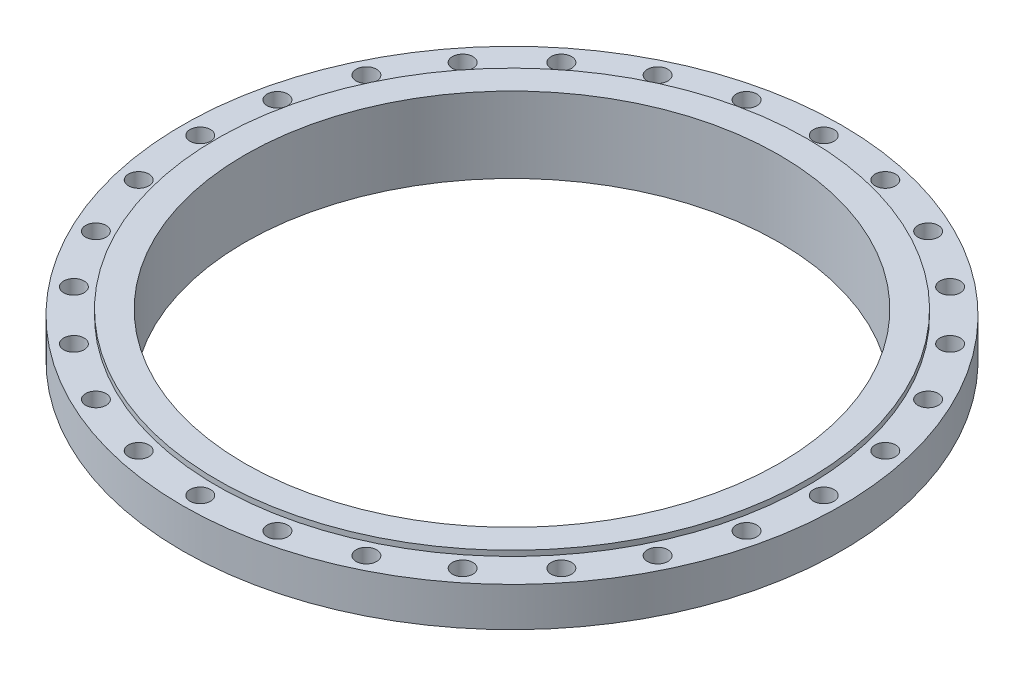
ISO-10303-21;
HEADER;
FILE_DESCRIPTION(('STEP AP214'),'2;1');
FILE_NAME('part.step','',(''),(''),'','','');
FILE_SCHEMA(('AUTOMOTIVE_DESIGN { 1 0 10303 214 1 1 1 1 }'));
ENDSEC;
DATA;
#1=APPLICATION_CONTEXT('core data for automotive mechanical design processes');
#2=APPLICATION_PROTOCOL_DEFINITION('international standard','automotive_design',2000,#1);
#3=PRODUCT_CONTEXT('',#1,'mechanical');
#4=PRODUCT('Part','Part','',(#3));
#5=PRODUCT_RELATED_PRODUCT_CATEGORY('part','',(#4));
#6=PRODUCT_DEFINITION_FORMATION('','',#4);
#7=PRODUCT_DEFINITION_CONTEXT('part definition',#1,'design');
#8=PRODUCT_DEFINITION('design','',#6,#7);
#9=PRODUCT_DEFINITION_SHAPE('','',#8);
#10=(LENGTH_UNIT() NAMED_UNIT(*) SI_UNIT(.MILLI.,.METRE.));
#11=(NAMED_UNIT(*) PLANE_ANGLE_UNIT() SI_UNIT($,.RADIAN.));
#12=(NAMED_UNIT(*) SI_UNIT($,.STERADIAN.) SOLID_ANGLE_UNIT());
#13=UNCERTAINTY_MEASURE_WITH_UNIT(LENGTH_MEASURE(1.E-05),#10,'distance_accuracy_value','');
#14=(GEOMETRIC_REPRESENTATION_CONTEXT(3) GLOBAL_UNCERTAINTY_ASSIGNED_CONTEXT((#13)) GLOBAL_UNIT_ASSIGNED_CONTEXT((#10,
#11,#12)) REPRESENTATION_CONTEXT('',''));
#15=CARTESIAN_POINT('',(0.,0.,0.));
#16=DIRECTION('',(0.,0.,1.));
#17=DIRECTION('',(1.,0.,0.));
#18=AXIS2_PLACEMENT_3D('',#15,#16,#17);
#19=CARTESIAN_POINT('',(-312.,0.,0.));
#20=DIRECTION('',(0.,1.,0.));
#21=DIRECTION('',(0.,0.,1.));
#22=AXIS2_PLACEMENT_3D('',#19,#20,#21);
#23=PLANE('',#22);
#24=CARTESIAN_POINT('',(0.,0.,0.));
#25=DIRECTION('',(0.,-1.,0.));
#26=DIRECTION('',(0.,0.,-1.));
#27=AXIS2_PLACEMENT_3D('',#24,#25,#26);
#28=CIRCLE('',#27,300.);
#29=CARTESIAN_POINT('',(0.,0.,-300.));
#30=VERTEX_POINT('',#29);
#31=EDGE_CURVE('E10',#30,#30,#28,.T.);
#32=ORIENTED_EDGE('',*,*,#31,.F.);
#33=EDGE_LOOP('',(#32));
#34=FACE_BOUND('',#33,.T.);
#35=CARTESIAN_POINT('',(0.,0.,0.));
#36=DIRECTION('',(0.,-1.,0.));
#37=DIRECTION('',(0.,0.,-1.));
#38=AXIS2_PLACEMENT_3D('',#35,#36,#37);
#39=CIRCLE('',#38,312.);
#40=CARTESIAN_POINT('',(0.,0.,-312.));
#41=VERTEX_POINT('',#40);
#42=EDGE_CURVE('E53',#41,#41,#39,.T.);
#43=ORIENTED_EDGE('',*,*,#42,.T.);
#44=EDGE_LOOP('',(#43));
#45=FACE_BOUND('',#44,.T.);
#46=ADVANCED_FACE('F34',(#34,#45),#23,.F.);
#47=CARTESIAN_POINT('',(0.,0.,0.));
#48=DIRECTION('',(0.,-1.,0.));
#49=DIRECTION('',(0.,0.,-1.));
#50=AXIS2_PLACEMENT_3D('',#47,#48,#49);
#51=CYLINDRICAL_SURFACE('',#50,300.);
#52=CARTESIAN_POINT('',(0.,85.,0.));
#53=DIRECTION('',(0.,-1.,0.));
#54=DIRECTION('',(0.,0.,-1.));
#55=AXIS2_PLACEMENT_3D('',#52,#53,#54);
#56=CIRCLE('',#55,300.);
#57=CARTESIAN_POINT('',(0.,85.,-300.));
#58=VERTEX_POINT('',#57);
#59=EDGE_CURVE('E41',#58,#58,#56,.T.);
#60=ORIENTED_EDGE('',*,*,#59,.F.);
#61=EDGE_LOOP('',(#60));
#62=FACE_BOUND('',#61,.T.);
#63=ORIENTED_EDGE('',*,*,#31,.T.);
#64=EDGE_LOOP('',(#63));
#65=FACE_BOUND('',#64,.T.);
#66=ADVANCED_FACE('F243',(#62,#65),#51,.F.);
#67=CARTESIAN_POINT('',(-300.,85.,0.));
#68=DIRECTION('',(0.,-1.,0.));
#69=DIRECTION('',(0.,0.,-1.));
#70=AXIS2_PLACEMENT_3D('',#67,#68,#69);
#71=PLANE('',#70);
#72=CARTESIAN_POINT('',(0.,85.,0.));
#73=DIRECTION('',(0.,-1.,0.));
#74=DIRECTION('',(0.,0.,-1.));
#75=AXIS2_PLACEMENT_3D('',#72,#73,#74);
#76=CIRCLE('',#75,331.5);
#77=CARTESIAN_POINT('',(0.,85.,-331.5));
#78=VERTEX_POINT('',#77);
#79=EDGE_CURVE('E46',#78,#78,#76,.T.);
#80=ORIENTED_EDGE('',*,*,#79,.F.);
#81=EDGE_LOOP('',(#80));
#82=FACE_BOUND('',#81,.T.);
#83=ORIENTED_EDGE('',*,*,#59,.T.);
#84=EDGE_LOOP('',(#83));
#85=FACE_BOUND('',#84,.T.);
#86=ADVANCED_FACE('F240',(#82,#85),#71,.F.);
#87=CARTESIAN_POINT('',(0.,0.,0.));
#88=DIRECTION('',(0.,-1.,0.));
#89=DIRECTION('',(0.,0.,-1.));
#90=AXIS2_PLACEMENT_3D('',#87,#88,#89);
#91=CYLINDRICAL_SURFACE('',#90,331.5);
#92=CARTESIAN_POINT('',(0.,79.,0.));
#93=DIRECTION('',(0.,-1.,0.));
#94=DIRECTION('',(0.,0.,-1.));
#95=AXIS2_PLACEMENT_3D('',#92,#93,#94);
#96=CIRCLE('',#95,331.5);
#97=CARTESIAN_POINT('',(0.,79.,-331.5));
#98=VERTEX_POINT('',#97);
#99=EDGE_CURVE('E233',#98,#98,#96,.T.);
#100=ORIENTED_EDGE('',*,*,#99,.F.);
#101=EDGE_LOOP('',(#100));
#102=FACE_BOUND('',#101,.T.);
#103=ORIENTED_EDGE('',*,*,#79,.T.);
#104=EDGE_LOOP('',(#103));
#105=FACE_BOUND('',#104,.T.);
#106=ADVANCED_FACE('F238',(#102,#105),#91,.T.);
#107=CARTESIAN_POINT('',(-331.5,79.,0.));
#108=DIRECTION('',(0.,-1.,0.));
#109=DIRECTION('',(0.,0.,-1.));
#110=AXIS2_PLACEMENT_3D('',#107,#108,#109);
#111=PLANE('',#110);
#112=CARTESIAN_POINT('',(-77.8823268847056,79.,-341.224769263639));
#113=DIRECTION('',(0.,1.,0.));
#114=DIRECTION('',(0.,0.,1.));
#115=AXIS2_PLACEMENT_3D('',#112,#113,#114);
#116=CIRCLE('',#115,11.5);
#117=CARTESIAN_POINT('',(-77.8823268847056,79.,-329.724769263639));
#118=VERTEX_POINT('',#117);
#119=EDGE_CURVE('E166',#118,#118,#116,.T.);
#120=ORIENTED_EDGE('',*,*,#119,.F.);
#121=EDGE_LOOP('',(#120));
#122=FACE_BOUND('',#121,.T.);
#123=CARTESIAN_POINT('',(-151.859308691144,79.,-315.33910376584));
#124=DIRECTION('',(0.,1.,0.));
#125=DIRECTION('',(0.,0.,1.));
#126=AXIS2_PLACEMENT_3D('',#123,#124,#125);
#127=CIRCLE('',#126,11.5000000000078);
#128=CARTESIAN_POINT('',(-151.859308691144,79.,-303.839103765832));
#129=VERTEX_POINT('',#128);
#130=EDGE_CURVE('E156',#129,#129,#127,.T.);
#131=ORIENTED_EDGE('',*,*,#130,.F.);
#132=EDGE_LOOP('',(#131));
#133=FACE_BOUND('',#132,.T.);
#134=CARTESIAN_POINT('',(-218.221430650554,79.,-273.641018863801));
#135=DIRECTION('',(0.,1.,0.));
#136=DIRECTION('',(0.,0.,1.));
#137=AXIS2_PLACEMENT_3D('',#134,#135,#136);
#138=CIRCLE('',#137,11.50000000001);
#139=CARTESIAN_POINT('',(-218.221430650554,79.,-262.141018863791));
#140=VERTEX_POINT('',#139);
#141=EDGE_CURVE('E153',#140,#140,#138,.T.);
#142=ORIENTED_EDGE('',*,*,#141,.F.);
#143=EDGE_LOOP('',(#142));
#144=FACE_BOUND('',#143,.T.);
#145=CARTESIAN_POINT('',(-273.641018863805,79.,-218.221430650545));
#146=DIRECTION('',(0.,1.,0.));
#147=DIRECTION('',(0.,0.,1.));
#148=AXIS2_PLACEMENT_3D('',#145,#146,#147);
#149=CIRCLE('',#148,11.500000000013);
#150=CARTESIAN_POINT('',(-273.641018863805,79.,-206.721430650532));
#151=VERTEX_POINT('',#150);
#152=EDGE_CURVE('E150',#151,#151,#149,.T.);
#153=ORIENTED_EDGE('',*,*,#152,.F.);
#154=EDGE_LOOP('',(#153));
#155=FACE_BOUND('',#154,.T.);
#156=CARTESIAN_POINT('',(-315.339103765838,79.,-151.859308691132));
#157=DIRECTION('',(0.,1.,0.));
#158=DIRECTION('',(0.,0.,1.));
#159=AXIS2_PLACEMENT_3D('',#156,#157,#158);
#160=CIRCLE('',#159,11.5000000000158);
#161=CARTESIAN_POINT('',(-315.339103765838,79.,-140.359308691116));
#162=VERTEX_POINT('',#161);
#163=EDGE_CURVE('E146',#162,#162,#160,.T.);
#164=ORIENTED_EDGE('',*,*,#163,.F.);
#165=EDGE_LOOP('',(#164));
#166=FACE_BOUND('',#165,.T.);
#167=CARTESIAN_POINT('',(-341.224769263627,79.,-77.8823268846955));
#168=DIRECTION('',(0.,1.,0.));
#169=DIRECTION('',(0.,0.,1.));
#170=AXIS2_PLACEMENT_3D('',#167,#168,#169);
#171=CIRCLE('',#170,11.5000000000189);
#172=CARTESIAN_POINT('',(-341.224769263627,79.,-66.3823268846766));
#173=VERTEX_POINT('',#172);
#174=EDGE_CURVE('E142',#173,#173,#171,.T.);
#175=ORIENTED_EDGE('',*,*,#174,.F.);
#176=EDGE_LOOP('',(#175));
#177=FACE_BOUND('',#176,.T.);
#178=CARTESIAN_POINT('',(-349.999999999985,79.,1.49213974509621E-11));
#179=DIRECTION('',(0.,1.,0.));
#180=DIRECTION('',(0.,0.,1.));
#181=AXIS2_PLACEMENT_3D('',#178,#179,#180);
#182=CIRCLE('',#181,11.5000000000221);
#183=CARTESIAN_POINT('',(-349.999999999985,79.,11.5000000000371));
#184=VERTEX_POINT('',#183);
#185=EDGE_CURVE('E138',#184,#184,#182,.T.);
#186=ORIENTED_EDGE('',*,*,#185,.F.);
#187=EDGE_LOOP('',(#186));
#188=FACE_BOUND('',#187,.T.);
#189=CARTESIAN_POINT('',(-341.22476926362,79.,77.8823268847246));
#190=DIRECTION('',(0.,1.,0.));
#191=DIRECTION('',(0.,0.,1.));
#192=AXIS2_PLACEMENT_3D('',#189,#190,#191);
#193=CIRCLE('',#192,11.5000000000249);
#194=CARTESIAN_POINT('',(-341.22476926362,79.,89.3823268847494));
#195=VERTEX_POINT('',#194);
#196=EDGE_CURVE('E134',#195,#195,#193,.T.);
#197=ORIENTED_EDGE('',*,*,#196,.F.);
#198=EDGE_LOOP('',(#197));
#199=FACE_BOUND('',#198,.T.);
#200=CARTESIAN_POINT('',(-315.339103765825,79.,151.859308691159));
#201=DIRECTION('',(0.,1.,0.));
#202=DIRECTION('',(0.,0.,1.));
#203=AXIS2_PLACEMENT_3D('',#200,#201,#202);
#204=CIRCLE('',#203,11.5000000000276);
#205=CARTESIAN_POINT('',(-315.339103765825,79.,163.359308691186));
#206=VERTEX_POINT('',#205);
#207=EDGE_CURVE('E130',#206,#206,#204,.T.);
#208=ORIENTED_EDGE('',*,*,#207,.F.);
#209=EDGE_LOOP('',(#208));
#210=FACE_BOUND('',#209,.T.);
#211=CARTESIAN_POINT('',(-273.641018863786,79.,218.221430650568));
#212=DIRECTION('',(0.,1.,0.));
#213=DIRECTION('',(0.,0.,1.));
#214=AXIS2_PLACEMENT_3D('',#211,#212,#213);
#215=CIRCLE('',#214,11.5000000000295);
#216=CARTESIAN_POINT('',(-273.641018863786,79.,229.721430650598));
#217=VERTEX_POINT('',#216);
#218=EDGE_CURVE('E126',#217,#217,#215,.T.);
#219=ORIENTED_EDGE('',*,*,#218,.F.);
#220=EDGE_LOOP('',(#219));
#221=FACE_BOUND('',#220,.T.);
#222=CARTESIAN_POINT('',(-218.22143065053,79.,273.64101886382));
#223=DIRECTION('',(0.,1.,0.));
#224=DIRECTION('',(0.,0.,1.));
#225=AXIS2_PLACEMENT_3D('',#222,#223,#224);
#226=CIRCLE('',#225,11.5000000000309);
#227=CARTESIAN_POINT('',(-218.22143065053,79.,285.141018863851));
#228=VERTEX_POINT('',#227);
#229=EDGE_CURVE('E122',#228,#228,#226,.T.);
#230=ORIENTED_EDGE('',*,*,#229,.F.);
#231=EDGE_LOOP('',(#230));
#232=FACE_BOUND('',#231,.T.);
#233=CARTESIAN_POINT('',(-151.859308691117,79.,315.339103765853));
#234=DIRECTION('',(0.,1.,0.));
#235=DIRECTION('',(0.,0.,1.));
#236=AXIS2_PLACEMENT_3D('',#233,#234,#235);
#237=CIRCLE('',#236,11.5000000000316);
#238=CARTESIAN_POINT('',(-151.859308691117,79.,326.839103765885));
#239=VERTEX_POINT('',#238);
#240=EDGE_CURVE('E118',#239,#239,#237,.T.);
#241=ORIENTED_EDGE('',*,*,#240,.F.);
#242=EDGE_LOOP('',(#241));
#243=FACE_BOUND('',#242,.T.);
#244=CARTESIAN_POINT('',(-77.8823268846807,79.,341.224769263642));
#245=DIRECTION('',(0.,1.,0.));
#246=DIRECTION('',(0.,0.,1.));
#247=AXIS2_PLACEMENT_3D('',#244,#245,#246);
#248=CIRCLE('',#247,11.5000000000315);
#249=CARTESIAN_POINT('',(-77.8823268846807,79.,352.724769263673));
#250=VERTEX_POINT('',#249);
#251=EDGE_CURVE('E114',#250,#250,#248,.T.);
#252=ORIENTED_EDGE('',*,*,#251,.F.);
#253=EDGE_LOOP('',(#252));
#254=FACE_BOUND('',#253,.T.);
#255=CARTESIAN_POINT('',(2.97570696259839E-11,79.,350.));
#256=DIRECTION('',(0.,1.,0.));
#257=DIRECTION('',(0.,0.,1.));
#258=AXIS2_PLACEMENT_3D('',#255,#256,#257);
#259=CIRCLE('',#258,11.5000000000308);
#260=CARTESIAN_POINT('',(2.97570696259839E-11,79.,361.500000000031));
#261=VERTEX_POINT('',#260);
#262=EDGE_CURVE('E110',#261,#261,#259,.T.);
#263=ORIENTED_EDGE('',*,*,#262,.F.);
#264=EDGE_LOOP('',(#263));
#265=FACE_BOUND('',#264,.T.);
#266=CARTESIAN_POINT('',(77.8823268847394,79.,341.224769263635));
#267=DIRECTION('',(0.,1.,0.));
#268=DIRECTION('',(0.,0.,1.));
#269=AXIS2_PLACEMENT_3D('',#266,#267,#268);
#270=CIRCLE('',#269,11.5000000000293);
#271=CARTESIAN_POINT('',(77.8823268847394,79.,352.724769263664));
#272=VERTEX_POINT('',#271);
#273=EDGE_CURVE('E106',#272,#272,#270,.T.);
#274=ORIENTED_EDGE('',*,*,#273,.F.);
#275=EDGE_LOOP('',(#274));
#276=FACE_BOUND('',#275,.T.);
#277=CARTESIAN_POINT('',(151.859308691174,79.,315.33910376584));
#278=DIRECTION('',(0.,1.,0.));
#279=DIRECTION('',(0.,0.,1.));
#280=AXIS2_PLACEMENT_3D('',#277,#278,#279);
#281=CIRCLE('',#280,11.5000000000272);
#282=CARTESIAN_POINT('',(151.859308691174,79.,326.839103765867));
#283=VERTEX_POINT('',#282);
#284=EDGE_CURVE('E102',#283,#283,#281,.T.);
#285=ORIENTED_EDGE('',*,*,#284,.F.);
#286=EDGE_LOOP('',(#285));
#287=FACE_BOUND('',#286,.T.);
#288=CARTESIAN_POINT('',(218.221430650583,79.,273.641018863801));
#289=DIRECTION('',(0.,1.,0.));
#290=DIRECTION('',(0.,0.,1.));
#291=AXIS2_PLACEMENT_3D('',#288,#289,#290);
#292=CIRCLE('',#291,11.5000000000244);
#293=CARTESIAN_POINT('',(218.221430650583,79.,285.141018863826));
#294=VERTEX_POINT('',#293);
#295=EDGE_CURVE('E98',#294,#294,#292,.T.);
#296=ORIENTED_EDGE('',*,*,#295,.F.);
#297=EDGE_LOOP('',(#296));
#298=FACE_BOUND('',#297,.T.);
#299=CARTESIAN_POINT('',(273.641018863835,79.,218.221430650545));
#300=DIRECTION('',(0.,1.,0.));
#301=DIRECTION('',(0.,0.,1.));
#302=AXIS2_PLACEMENT_3D('',#299,#300,#301);
#303=CIRCLE('',#302,11.5000000000213);
#304=CARTESIAN_POINT('',(273.641018863835,79.,229.721430650566));
#305=VERTEX_POINT('',#304);
#306=EDGE_CURVE('E94',#305,#305,#303,.T.);
#307=ORIENTED_EDGE('',*,*,#306,.F.);
#308=EDGE_LOOP('',(#307));
#309=FACE_BOUND('',#308,.T.);
#310=CARTESIAN_POINT('',(315.339103765868,79.,151.859308691132));
#311=DIRECTION('',(0.,1.,0.));
#312=DIRECTION('',(0.,0.,1.));
#313=AXIS2_PLACEMENT_3D('',#310,#311,#312);
#314=CIRCLE('',#313,11.500000000018);
#315=CARTESIAN_POINT('',(315.339103765868,79.,163.35930869115));
#316=VERTEX_POINT('',#315);
#317=EDGE_CURVE('E90',#316,#316,#314,.T.);
#318=ORIENTED_EDGE('',*,*,#317,.F.);
#319=EDGE_LOOP('',(#318));
#320=FACE_BOUND('',#319,.T.);
#321=CARTESIAN_POINT('',(341.224769263656,79.,77.8823268846955));
#322=DIRECTION('',(0.,1.,0.));
#323=DIRECTION('',(0.,0.,1.));
#324=AXIS2_PLACEMENT_3D('',#321,#322,#323);
#325=CIRCLE('',#324,11.5000000000145);
#326=CARTESIAN_POINT('',(341.224769263656,79.,89.38232688471));
#327=VERTEX_POINT('',#326);
#328=EDGE_CURVE('E86',#327,#327,#325,.T.);
#329=ORIENTED_EDGE('',*,*,#328,.F.);
#330=EDGE_LOOP('',(#329));
#331=FACE_BOUND('',#330,.T.);
#332=CARTESIAN_POINT('',(350.000000000015,79.,-1.48785348129919E-11));
#333=DIRECTION('',(0.,1.,0.));
#334=DIRECTION('',(0.,0.,1.));
#335=AXIS2_PLACEMENT_3D('',#332,#333,#334);
#336=CIRCLE('',#335,11.500000000011);
#337=CARTESIAN_POINT('',(350.000000000015,79.,11.4999999999962));
#338=VERTEX_POINT('',#337);
#339=EDGE_CURVE('E82',#338,#338,#336,.T.);
#340=ORIENTED_EDGE('',*,*,#339,.F.);
#341=EDGE_LOOP('',(#340));
#342=FACE_BOUND('',#341,.T.);
#343=CARTESIAN_POINT('',(341.22476926365,79.,-77.8823268847245));
#344=DIRECTION('',(0.,1.,0.));
#345=DIRECTION('',(0.,0.,1.));
#346=AXIS2_PLACEMENT_3D('',#343,#344,#345);
#347=CIRCLE('',#346,11.5000000000079);
#348=CARTESIAN_POINT('',(341.22476926365,79.,-66.3823268847167));
#349=VERTEX_POINT('',#348);
#350=EDGE_CURVE('E78',#349,#349,#347,.T.);
#351=ORIENTED_EDGE('',*,*,#350,.F.);
#352=EDGE_LOOP('',(#351));
#353=FACE_BOUND('',#352,.T.);
#354=CARTESIAN_POINT('',(315.339103765855,79.,-151.859308691159));
#355=DIRECTION('',(0.,1.,0.));
#356=DIRECTION('',(0.,0.,1.));
#357=AXIS2_PLACEMENT_3D('',#354,#355,#356);
#358=CIRCLE('',#357,11.500000000005);
#359=CARTESIAN_POINT('',(315.339103765855,79.,-140.359308691154));
#360=VERTEX_POINT('',#359);
#361=EDGE_CURVE('E74',#360,#360,#358,.T.);
#362=ORIENTED_EDGE('',*,*,#361,.F.);
#363=EDGE_LOOP('',(#362));
#364=FACE_BOUND('',#363,.T.);
#365=CARTESIAN_POINT('',(273.641018863816,79.,-218.221430650568));
#366=DIRECTION('',(0.,1.,0.));
#367=DIRECTION('',(0.,0.,1.));
#368=AXIS2_PLACEMENT_3D('',#365,#366,#367);
#369=CIRCLE('',#368,11.5000000000026);
#370=CARTESIAN_POINT('',(273.641018863816,79.,-206.721430650566));
#371=VERTEX_POINT('',#370);
#372=EDGE_CURVE('E70',#371,#371,#369,.T.);
#373=ORIENTED_EDGE('',*,*,#372,.F.);
#374=EDGE_LOOP('',(#373));
#375=FACE_BOUND('',#374,.T.);
#376=CARTESIAN_POINT('',(218.22143065056,79.,-273.64101886382));
#377=DIRECTION('',(0.,1.,0.));
#378=DIRECTION('',(0.,0.,1.));
#379=AXIS2_PLACEMENT_3D('',#376,#377,#378);
#380=CIRCLE('',#379,11.5000000000009);
#381=CARTESIAN_POINT('',(218.22143065056,79.,-262.141018863819));
#382=VERTEX_POINT('',#381);
#383=EDGE_CURVE('E66',#382,#382,#380,.T.);
#384=ORIENTED_EDGE('',*,*,#383,.F.);
#385=EDGE_LOOP('',(#384));
#386=FACE_BOUND('',#385,.T.);
#387=CARTESIAN_POINT('',(151.859308691146,79.,-315.339103765847));
#388=DIRECTION('',(0.,1.,0.));
#389=DIRECTION('',(0.,0.,1.));
#390=AXIS2_PLACEMENT_3D('',#387,#388,#389);
#391=CIRCLE('',#390,11.5);
#392=CARTESIAN_POINT('',(151.859308691146,79.,-303.839103765847));
#393=VERTEX_POINT('',#392);
#394=EDGE_CURVE('E62',#393,#393,#391,.T.);
#395=ORIENTED_EDGE('',*,*,#394,.F.);
#396=EDGE_LOOP('',(#395));
#397=FACE_BOUND('',#396,.T.);
#398=CARTESIAN_POINT('',(77.8823268847102,79.,-341.224769263638));
#399=DIRECTION('',(0.,1.,0.));
#400=DIRECTION('',(0.,0.,1.));
#401=AXIS2_PLACEMENT_3D('',#398,#399,#400);
#402=CIRCLE('',#401,11.5);
#403=CARTESIAN_POINT('',(77.8823268847102,79.,-329.724769263638));
#404=VERTEX_POINT('',#403);
#405=EDGE_CURVE('E58',#404,#404,#402,.T.);
#406=ORIENTED_EDGE('',*,*,#405,.F.);
#407=EDGE_LOOP('',(#406));
#408=FACE_BOUND('',#407,.T.);
#409=CARTESIAN_POINT('',(0.,79.,-350.));
#410=DIRECTION('',(0.,1.,0.));
#411=DIRECTION('',(0.,0.,1.));
#412=AXIS2_PLACEMENT_3D('',#409,#410,#411);
#413=CIRCLE('',#412,11.5);
#414=CARTESIAN_POINT('',(0.,79.,-338.5));
#415=VERTEX_POINT('',#414);
#416=EDGE_CURVE('E54',#415,#415,#413,.T.);
#417=ORIENTED_EDGE('',*,*,#416,.F.);
#418=EDGE_LOOP('',(#417));
#419=FACE_BOUND('',#418,.T.);
#420=CARTESIAN_POINT('',(0.,79.,0.));
#421=DIRECTION('',(0.,-1.,0.));
#422=DIRECTION('',(0.,0.,-1.));
#423=AXIS2_PLACEMENT_3D('',#420,#421,#422);
#424=CIRCLE('',#423,370.);
#425=CARTESIAN_POINT('',(0.,79.,-370.));
#426=VERTEX_POINT('',#425);
#427=EDGE_CURVE('E230',#426,#426,#424,.T.);
#428=ORIENTED_EDGE('',*,*,#427,.F.);
#429=EDGE_LOOP('',(#428));
#430=FACE_BOUND('',#429,.T.);
#431=ORIENTED_EDGE('',*,*,#99,.T.);
#432=EDGE_LOOP('',(#431));
#433=FACE_BOUND('',#432,.T.);
#434=ADVANCED_FACE('F255',(#122,#133,#144,#155,#166,#177,#188,#199,#210,#221,#232,#243,#254,
#265,#276,#287,#298,#309,#320,#331,#342,#353,#364,#375,#386,#397,#408,#419,#430,#433),#111,.F.);
#435=CARTESIAN_POINT('',(0.,0.,0.));
#436=DIRECTION('',(0.,-1.,0.));
#437=DIRECTION('',(0.,0.,-1.));
#438=AXIS2_PLACEMENT_3D('',#435,#436,#437);
#439=CYLINDRICAL_SURFACE('',#438,370.);
#440=CARTESIAN_POINT('',(0.,35.,0.));
#441=DIRECTION('',(0.,-1.,0.));
#442=DIRECTION('',(0.,0.,-1.));
#443=AXIS2_PLACEMENT_3D('',#440,#441,#442);
#444=CIRCLE('',#443,370.);
#445=CARTESIAN_POINT('',(0.,35.,-370.));
#446=VERTEX_POINT('',#445);
#447=EDGE_CURVE('E227',#446,#446,#444,.T.);
#448=ORIENTED_EDGE('',*,*,#447,.F.);
#449=EDGE_LOOP('',(#448));
#450=FACE_BOUND('',#449,.T.);
#451=ORIENTED_EDGE('',*,*,#427,.T.);
#452=EDGE_LOOP('',(#451));
#453=FACE_BOUND('',#452,.T.);
#454=ADVANCED_FACE('F259',(#450,#453),#439,.T.);
#455=CARTESIAN_POINT('',(-370.,35.,0.));
#456=DIRECTION('',(0.,1.,0.));
#457=DIRECTION('',(0.,0.,1.));
#458=AXIS2_PLACEMENT_3D('',#455,#456,#457);
#459=PLANE('',#458);
#460=CARTESIAN_POINT('',(-77.8823268847056,35.,-341.224769263639));
#461=DIRECTION('',(0.,1.,0.));
#462=DIRECTION('',(0.,0.,1.));
#463=AXIS2_PLACEMENT_3D('',#460,#461,#462);
#464=CIRCLE('',#463,11.5);
#465=CARTESIAN_POINT('',(-77.8823268847056,35.,-329.724769263639));
#466=VERTEX_POINT('',#465);
#467=EDGE_CURVE('E37',#466,#466,#464,.T.);
#468=ORIENTED_EDGE('',*,*,#467,.T.);
#469=EDGE_LOOP('',(#468));
#470=FACE_BOUND('',#469,.T.);
#471=CARTESIAN_POINT('',(-151.859308691144,35.,-315.33910376584));
#472=DIRECTION('',(0.,1.,0.));
#473=DIRECTION('',(0.,0.,1.));
#474=AXIS2_PLACEMENT_3D('',#471,#472,#473);
#475=CIRCLE('',#474,11.5000000000078);
#476=CARTESIAN_POINT('',(-151.859308691144,35.,-303.839103765832));
#477=VERTEX_POINT('',#476);
#478=EDGE_CURVE('E154',#477,#477,#475,.T.);
#479=ORIENTED_EDGE('',*,*,#478,.T.);
#480=EDGE_LOOP('',(#479));
#481=FACE_BOUND('',#480,.T.);
#482=CARTESIAN_POINT('',(-218.221430650554,35.,-273.641018863801));
#483=DIRECTION('',(0.,1.,0.));
#484=DIRECTION('',(0.,0.,1.));
#485=AXIS2_PLACEMENT_3D('',#482,#483,#484);
#486=CIRCLE('',#485,11.50000000001);
#487=CARTESIAN_POINT('',(-218.221430650554,35.,-262.141018863791));
#488=VERTEX_POINT('',#487);
#489=EDGE_CURVE('E151',#488,#488,#486,.T.);
#490=ORIENTED_EDGE('',*,*,#489,.T.);
#491=EDGE_LOOP('',(#490));
#492=FACE_BOUND('',#491,.T.);
#493=CARTESIAN_POINT('',(-273.641018863805,35.,-218.221430650545));
#494=DIRECTION('',(0.,1.,0.));
#495=DIRECTION('',(0.,0.,1.));
#496=AXIS2_PLACEMENT_3D('',#493,#494,#495);
#497=CIRCLE('',#496,11.500000000013);
#498=CARTESIAN_POINT('',(-273.641018863805,35.,-206.721430650532));
#499=VERTEX_POINT('',#498);
#500=EDGE_CURVE('E147',#499,#499,#497,.T.);
#501=ORIENTED_EDGE('',*,*,#500,.T.);
#502=EDGE_LOOP('',(#501));
#503=FACE_BOUND('',#502,.T.);
#504=CARTESIAN_POINT('',(-315.339103765838,35.,-151.859308691132));
#505=DIRECTION('',(0.,1.,0.));
#506=DIRECTION('',(0.,0.,1.));
#507=AXIS2_PLACEMENT_3D('',#504,#505,#506);
#508=CIRCLE('',#507,11.5000000000158);
#509=CARTESIAN_POINT('',(-315.339103765838,35.,-140.359308691116));
#510=VERTEX_POINT('',#509);
#511=EDGE_CURVE('E143',#510,#510,#508,.T.);
#512=ORIENTED_EDGE('',*,*,#511,.T.);
#513=EDGE_LOOP('',(#512));
#514=FACE_BOUND('',#513,.T.);
#515=CARTESIAN_POINT('',(-341.224769263627,35.,-77.8823268846955));
#516=DIRECTION('',(0.,1.,0.));
#517=DIRECTION('',(0.,0.,1.));
#518=AXIS2_PLACEMENT_3D('',#515,#516,#517);
#519=CIRCLE('',#518,11.5000000000189);
#520=CARTESIAN_POINT('',(-341.224769263627,35.,-66.3823268846766));
#521=VERTEX_POINT('',#520);
#522=EDGE_CURVE('E139',#521,#521,#519,.T.);
#523=ORIENTED_EDGE('',*,*,#522,.T.);
#524=EDGE_LOOP('',(#523));
#525=FACE_BOUND('',#524,.T.);
#526=CARTESIAN_POINT('',(-349.999999999985,35.,1.49213974509621E-11));
#527=DIRECTION('',(0.,1.,0.));
#528=DIRECTION('',(0.,0.,1.));
#529=AXIS2_PLACEMENT_3D('',#526,#527,#528);
#530=CIRCLE('',#529,11.5000000000221);
#531=CARTESIAN_POINT('',(-349.999999999985,35.,11.5000000000371));
#532=VERTEX_POINT('',#531);
#533=EDGE_CURVE('E135',#532,#532,#530,.T.);
#534=ORIENTED_EDGE('',*,*,#533,.T.);
#535=EDGE_LOOP('',(#534));
#536=FACE_BOUND('',#535,.T.);
#537=CARTESIAN_POINT('',(-341.22476926362,35.,77.8823268847246));
#538=DIRECTION('',(0.,1.,0.));
#539=DIRECTION('',(0.,0.,1.));
#540=AXIS2_PLACEMENT_3D('',#537,#538,#539);
#541=CIRCLE('',#540,11.5000000000249);
#542=CARTESIAN_POINT('',(-341.22476926362,35.,89.3823268847494));
#543=VERTEX_POINT('',#542);
#544=EDGE_CURVE('E131',#543,#543,#541,.T.);
#545=ORIENTED_EDGE('',*,*,#544,.T.);
#546=EDGE_LOOP('',(#545));
#547=FACE_BOUND('',#546,.T.);
#548=CARTESIAN_POINT('',(-315.339103765825,35.,151.859308691159));
#549=DIRECTION('',(0.,1.,0.));
#550=DIRECTION('',(0.,0.,1.));
#551=AXIS2_PLACEMENT_3D('',#548,#549,#550);
#552=CIRCLE('',#551,11.5000000000276);
#553=CARTESIAN_POINT('',(-315.339103765825,35.,163.359308691186));
#554=VERTEX_POINT('',#553);
#555=EDGE_CURVE('E127',#554,#554,#552,.T.);
#556=ORIENTED_EDGE('',*,*,#555,.T.);
#557=EDGE_LOOP('',(#556));
#558=FACE_BOUND('',#557,.T.);
#559=CARTESIAN_POINT('',(-273.641018863786,35.,218.221430650568));
#560=DIRECTION('',(0.,1.,0.));
#561=DIRECTION('',(0.,0.,1.));
#562=AXIS2_PLACEMENT_3D('',#559,#560,#561);
#563=CIRCLE('',#562,11.5000000000295);
#564=CARTESIAN_POINT('',(-273.641018863786,35.,229.721430650598));
#565=VERTEX_POINT('',#564);
#566=EDGE_CURVE('E123',#565,#565,#563,.T.);
#567=ORIENTED_EDGE('',*,*,#566,.T.);
#568=EDGE_LOOP('',(#567));
#569=FACE_BOUND('',#568,.T.);
#570=CARTESIAN_POINT('',(-218.22143065053,35.,273.64101886382));
#571=DIRECTION('',(0.,1.,0.));
#572=DIRECTION('',(0.,0.,1.));
#573=AXIS2_PLACEMENT_3D('',#570,#571,#572);
#574=CIRCLE('',#573,11.5000000000309);
#575=CARTESIAN_POINT('',(-218.22143065053,35.,285.141018863851));
#576=VERTEX_POINT('',#575);
#577=EDGE_CURVE('E119',#576,#576,#574,.T.);
#578=ORIENTED_EDGE('',*,*,#577,.T.);
#579=EDGE_LOOP('',(#578));
#580=FACE_BOUND('',#579,.T.);
#581=CARTESIAN_POINT('',(-151.859308691117,35.,315.339103765853));
#582=DIRECTION('',(0.,1.,0.));
#583=DIRECTION('',(0.,0.,1.));
#584=AXIS2_PLACEMENT_3D('',#581,#582,#583);
#585=CIRCLE('',#584,11.5000000000316);
#586=CARTESIAN_POINT('',(-151.859308691117,35.,326.839103765885));
#587=VERTEX_POINT('',#586);
#588=EDGE_CURVE('E115',#587,#587,#585,.T.);
#589=ORIENTED_EDGE('',*,*,#588,.T.);
#590=EDGE_LOOP('',(#589));
#591=FACE_BOUND('',#590,.T.);
#592=CARTESIAN_POINT('',(-77.8823268846807,35.,341.224769263642));
#593=DIRECTION('',(0.,1.,0.));
#594=DIRECTION('',(0.,0.,1.));
#595=AXIS2_PLACEMENT_3D('',#592,#593,#594);
#596=CIRCLE('',#595,11.5000000000315);
#597=CARTESIAN_POINT('',(-77.8823268846807,35.,352.724769263673));
#598=VERTEX_POINT('',#597);
#599=EDGE_CURVE('E111',#598,#598,#596,.T.);
#600=ORIENTED_EDGE('',*,*,#599,.T.);
#601=EDGE_LOOP('',(#600));
#602=FACE_BOUND('',#601,.T.);
#603=CARTESIAN_POINT('',(2.97570696259839E-11,35.,350.));
#604=DIRECTION('',(0.,1.,0.));
#605=DIRECTION('',(0.,0.,1.));
#606=AXIS2_PLACEMENT_3D('',#603,#604,#605);
#607=CIRCLE('',#606,11.5000000000308);
#608=CARTESIAN_POINT('',(2.97570696259839E-11,35.,361.500000000031));
#609=VERTEX_POINT('',#608);
#610=EDGE_CURVE('E107',#609,#609,#607,.T.);
#611=ORIENTED_EDGE('',*,*,#610,.T.);
#612=EDGE_LOOP('',(#611));
#613=FACE_BOUND('',#612,.T.);
#614=CARTESIAN_POINT('',(77.8823268847394,35.,341.224769263635));
#615=DIRECTION('',(0.,1.,0.));
#616=DIRECTION('',(0.,0.,1.));
#617=AXIS2_PLACEMENT_3D('',#614,#615,#616);
#618=CIRCLE('',#617,11.5000000000293);
#619=CARTESIAN_POINT('',(77.8823268847394,35.,352.724769263664));
#620=VERTEX_POINT('',#619);
#621=EDGE_CURVE('E103',#620,#620,#618,.T.);
#622=ORIENTED_EDGE('',*,*,#621,.T.);
#623=EDGE_LOOP('',(#622));
#624=FACE_BOUND('',#623,.T.);
#625=CARTESIAN_POINT('',(151.859308691174,35.,315.33910376584));
#626=DIRECTION('',(0.,1.,0.));
#627=DIRECTION('',(0.,0.,1.));
#628=AXIS2_PLACEMENT_3D('',#625,#626,#627);
#629=CIRCLE('',#628,11.5000000000272);
#630=CARTESIAN_POINT('',(151.859308691174,35.,326.839103765867));
#631=VERTEX_POINT('',#630);
#632=EDGE_CURVE('E99',#631,#631,#629,.T.);
#633=ORIENTED_EDGE('',*,*,#632,.T.);
#634=EDGE_LOOP('',(#633));
#635=FACE_BOUND('',#634,.T.);
#636=CARTESIAN_POINT('',(218.221430650583,35.,273.641018863801));
#637=DIRECTION('',(0.,1.,0.));
#638=DIRECTION('',(0.,0.,1.));
#639=AXIS2_PLACEMENT_3D('',#636,#637,#638);
#640=CIRCLE('',#639,11.5000000000244);
#641=CARTESIAN_POINT('',(218.221430650583,35.,285.141018863826));
#642=VERTEX_POINT('',#641);
#643=EDGE_CURVE('E95',#642,#642,#640,.T.);
#644=ORIENTED_EDGE('',*,*,#643,.T.);
#645=EDGE_LOOP('',(#644));
#646=FACE_BOUND('',#645,.T.);
#647=CARTESIAN_POINT('',(273.641018863835,35.,218.221430650545));
#648=DIRECTION('',(0.,1.,0.));
#649=DIRECTION('',(0.,0.,1.));
#650=AXIS2_PLACEMENT_3D('',#647,#648,#649);
#651=CIRCLE('',#650,11.5000000000213);
#652=CARTESIAN_POINT('',(273.641018863835,35.,229.721430650566));
#653=VERTEX_POINT('',#652);
#654=EDGE_CURVE('E91',#653,#653,#651,.T.);
#655=ORIENTED_EDGE('',*,*,#654,.T.);
#656=EDGE_LOOP('',(#655));
#657=FACE_BOUND('',#656,.T.);
#658=CARTESIAN_POINT('',(315.339103765868,35.,151.859308691132));
#659=DIRECTION('',(0.,1.,0.));
#660=DIRECTION('',(0.,0.,1.));
#661=AXIS2_PLACEMENT_3D('',#658,#659,#660);
#662=CIRCLE('',#661,11.500000000018);
#663=CARTESIAN_POINT('',(315.339103765868,35.,163.35930869115));
#664=VERTEX_POINT('',#663);
#665=EDGE_CURVE('E87',#664,#664,#662,.T.);
#666=ORIENTED_EDGE('',*,*,#665,.T.);
#667=EDGE_LOOP('',(#666));
#668=FACE_BOUND('',#667,.T.);
#669=CARTESIAN_POINT('',(341.224769263656,35.,77.8823268846955));
#670=DIRECTION('',(0.,1.,0.));
#671=DIRECTION('',(0.,0.,1.));
#672=AXIS2_PLACEMENT_3D('',#669,#670,#671);
#673=CIRCLE('',#672,11.5000000000145);
#674=CARTESIAN_POINT('',(341.224769263656,35.,89.38232688471));
#675=VERTEX_POINT('',#674);
#676=EDGE_CURVE('E83',#675,#675,#673,.T.);
#677=ORIENTED_EDGE('',*,*,#676,.T.);
#678=EDGE_LOOP('',(#677));
#679=FACE_BOUND('',#678,.T.);
#680=CARTESIAN_POINT('',(350.000000000015,35.,-1.48785348129919E-11));
#681=DIRECTION('',(0.,1.,0.));
#682=DIRECTION('',(0.,0.,1.));
#683=AXIS2_PLACEMENT_3D('',#680,#681,#682);
#684=CIRCLE('',#683,11.500000000011);
#685=CARTESIAN_POINT('',(350.000000000015,35.,11.4999999999962));
#686=VERTEX_POINT('',#685);
#687=EDGE_CURVE('E79',#686,#686,#684,.T.);
#688=ORIENTED_EDGE('',*,*,#687,.T.);
#689=EDGE_LOOP('',(#688));
#690=FACE_BOUND('',#689,.T.);
#691=CARTESIAN_POINT('',(341.22476926365,35.,-77.8823268847245));
#692=DIRECTION('',(0.,1.,0.));
#693=DIRECTION('',(0.,0.,1.));
#694=AXIS2_PLACEMENT_3D('',#691,#692,#693);
#695=CIRCLE('',#694,11.5000000000079);
#696=CARTESIAN_POINT('',(341.22476926365,35.,-66.3823268847167));
#697=VERTEX_POINT('',#696);
#698=EDGE_CURVE('E75',#697,#697,#695,.T.);
#699=ORIENTED_EDGE('',*,*,#698,.T.);
#700=EDGE_LOOP('',(#699));
#701=FACE_BOUND('',#700,.T.);
#702=CARTESIAN_POINT('',(315.339103765855,35.,-151.859308691159));
#703=DIRECTION('',(0.,1.,0.));
#704=DIRECTION('',(0.,0.,1.));
#705=AXIS2_PLACEMENT_3D('',#702,#703,#704);
#706=CIRCLE('',#705,11.500000000005);
#707=CARTESIAN_POINT('',(315.339103765855,35.,-140.359308691154));
#708=VERTEX_POINT('',#707);
#709=EDGE_CURVE('E71',#708,#708,#706,.T.);
#710=ORIENTED_EDGE('',*,*,#709,.T.);
#711=EDGE_LOOP('',(#710));
#712=FACE_BOUND('',#711,.T.);
#713=CARTESIAN_POINT('',(273.641018863816,35.,-218.221430650568));
#714=DIRECTION('',(0.,1.,0.));
#715=DIRECTION('',(0.,0.,1.));
#716=AXIS2_PLACEMENT_3D('',#713,#714,#715);
#717=CIRCLE('',#716,11.5000000000026);
#718=CARTESIAN_POINT('',(273.641018863816,35.,-206.721430650566));
#719=VERTEX_POINT('',#718);
#720=EDGE_CURVE('E67',#719,#719,#717,.T.);
#721=ORIENTED_EDGE('',*,*,#720,.T.);
#722=EDGE_LOOP('',(#721));
#723=FACE_BOUND('',#722,.T.);
#724=CARTESIAN_POINT('',(218.22143065056,35.,-273.64101886382));
#725=DIRECTION('',(0.,1.,0.));
#726=DIRECTION('',(0.,0.,1.));
#727=AXIS2_PLACEMENT_3D('',#724,#725,#726);
#728=CIRCLE('',#727,11.5000000000009);
#729=CARTESIAN_POINT('',(218.22143065056,35.,-262.141018863819));
#730=VERTEX_POINT('',#729);
#731=EDGE_CURVE('E63',#730,#730,#728,.T.);
#732=ORIENTED_EDGE('',*,*,#731,.T.);
#733=EDGE_LOOP('',(#732));
#734=FACE_BOUND('',#733,.T.);
#735=CARTESIAN_POINT('',(151.859308691146,35.,-315.339103765847));
#736=DIRECTION('',(0.,1.,0.));
#737=DIRECTION('',(0.,0.,1.));
#738=AXIS2_PLACEMENT_3D('',#735,#736,#737);
#739=CIRCLE('',#738,11.5);
#740=CARTESIAN_POINT('',(151.859308691146,35.,-303.839103765847));
#741=VERTEX_POINT('',#740);
#742=EDGE_CURVE('E59',#741,#741,#739,.T.);
#743=ORIENTED_EDGE('',*,*,#742,.T.);
#744=EDGE_LOOP('',(#743));
#745=FACE_BOUND('',#744,.T.);
#746=CARTESIAN_POINT('',(77.8823268847102,35.,-341.224769263638));
#747=DIRECTION('',(0.,1.,0.));
#748=DIRECTION('',(0.,0.,1.));
#749=AXIS2_PLACEMENT_3D('',#746,#747,#748);
#750=CIRCLE('',#749,11.5);
#751=CARTESIAN_POINT('',(77.8823268847102,35.,-329.724769263638));
#752=VERTEX_POINT('',#751);
#753=EDGE_CURVE('E55',#752,#752,#750,.T.);
#754=ORIENTED_EDGE('',*,*,#753,.T.);
#755=EDGE_LOOP('',(#754));
#756=FACE_BOUND('',#755,.T.);
#757=CARTESIAN_POINT('',(0.,35.,-350.));
#758=DIRECTION('',(0.,1.,0.));
#759=DIRECTION('',(0.,0.,1.));
#760=AXIS2_PLACEMENT_3D('',#757,#758,#759);
#761=CIRCLE('',#760,11.5);
#762=CARTESIAN_POINT('',(0.,35.,-338.5));
#763=VERTEX_POINT('',#762);
#764=EDGE_CURVE('E50',#763,#763,#761,.T.);
#765=ORIENTED_EDGE('',*,*,#764,.T.);
#766=EDGE_LOOP('',(#765));
#767=FACE_BOUND('',#766,.T.);
#768=CARTESIAN_POINT('',(0.,35.,0.));
#769=DIRECTION('',(0.,-1.,0.));
#770=DIRECTION('',(0.,0.,-1.));
#771=AXIS2_PLACEMENT_3D('',#768,#769,#770);
#772=CIRCLE('',#771,329.);
#773=CARTESIAN_POINT('',(0.,35.,-329.));
#774=VERTEX_POINT('',#773);
#775=EDGE_CURVE('E224',#774,#774,#772,.T.);
#776=ORIENTED_EDGE('',*,*,#775,.F.);
#777=EDGE_LOOP('',(#776));
#778=FACE_BOUND('',#777,.T.);
#779=ORIENTED_EDGE('',*,*,#447,.T.);
#780=EDGE_LOOP('',(#779));
#781=FACE_BOUND('',#780,.T.);
#782=ADVANCED_FACE('F263',(#470,#481,#492,#503,#514,#525,#536,#547,#558,#569,#580,#591,#602,
#613,#624,#635,#646,#657,#668,#679,#690,#701,#712,#723,#734,#745,#756,#767,#778,#781),#459,.F.);
#783=CARTESIAN_POINT('',(0.,28.,0.));
#784=DIRECTION('',(0.,-1.,0.));
#785=DIRECTION('',(0.,0.,-1.));
#786=AXIS2_PLACEMENT_3D('',#783,#784,#785);
#787=TOROIDAL_SURFACE('',#786,329.,6.99999999999998);
#788=CARTESIAN_POINT('',(0.,30.2702702702703,0.));
#789=DIRECTION('',(0.,-1.,0.));
#790=DIRECTION('',(0.,0.,-1.));
#791=AXIS2_PLACEMENT_3D('',#788,#789,#790);
#792=CIRCLE('',#791,322.378378378378);
#793=CARTESIAN_POINT('',(0.,30.2702702702703,-322.378378378378));
#794=VERTEX_POINT('',#793);
#795=EDGE_CURVE('E221',#794,#794,#792,.T.);
#796=ORIENTED_EDGE('',*,*,#795,.F.);
#797=EDGE_LOOP('',(#796));
#798=FACE_BOUND('',#797,.T.);
#799=ORIENTED_EDGE('',*,*,#775,.T.);
#800=EDGE_LOOP('',(#799));
#801=FACE_BOUND('',#800,.T.);
#802=ADVANCED_FACE('F267',(#798,#801),#787,.F.);
#803=CARTESIAN_POINT('',(0.,30.2702702702703,0.));
#804=DIRECTION('',(0.,1.,0.));
#805=DIRECTION('',(0.,0.,1.));
#806=AXIS2_PLACEMENT_3D('',#803,#804,#805);
#807=CONICAL_SURFACE('',#806,322.378378378378,0.330297354829253);
#808=ORIENTED_EDGE('',*,*,#42,.F.);
#809=EDGE_LOOP('',(#808));
#810=FACE_BOUND('',#809,.T.);
#811=ORIENTED_EDGE('',*,*,#795,.T.);
#812=EDGE_LOOP('',(#811));
#813=FACE_BOUND('',#812,.T.);
#814=ADVANCED_FACE('F271',(#810,#813),#807,.T.);
#815=CARTESIAN_POINT('',(0.,0.,-350.));
#816=DIRECTION('',(0.,1.,0.));
#817=DIRECTION('',(0.,0.,1.));
#818=AXIS2_PLACEMENT_3D('',#815,#816,#817);
#819=CYLINDRICAL_SURFACE('',#818,11.5);
#820=ORIENTED_EDGE('',*,*,#416,.T.);
#821=EDGE_LOOP('',(#820));
#822=FACE_BOUND('',#821,.T.);
#823=ORIENTED_EDGE('',*,*,#764,.F.);
#824=EDGE_LOOP('',(#823));
#825=FACE_BOUND('',#824,.T.);
#826=ADVANCED_FACE('F275',(#822,#825),#819,.F.);
#827=CARTESIAN_POINT('',(77.8823268847102,0.,-341.224769263638));
#828=DIRECTION('',(0.,1.,0.));
#829=DIRECTION('',(0.,0.,1.));
#830=AXIS2_PLACEMENT_3D('',#827,#828,#829);
#831=CYLINDRICAL_SURFACE('',#830,11.5);
#832=ORIENTED_EDGE('',*,*,#405,.T.);
#833=EDGE_LOOP('',(#832));
#834=FACE_BOUND('',#833,.T.);
#835=ORIENTED_EDGE('',*,*,#753,.F.);
#836=EDGE_LOOP('',(#835));
#837=FACE_BOUND('',#836,.T.);
#838=ADVANCED_FACE('F279',(#834,#837),#831,.F.);
#839=CARTESIAN_POINT('',(151.859308691146,0.,-315.339103765847));
#840=DIRECTION('',(0.,1.,0.));
#841=DIRECTION('',(0.,0.,1.));
#842=AXIS2_PLACEMENT_3D('',#839,#840,#841);
#843=CYLINDRICAL_SURFACE('',#842,11.5);
#844=ORIENTED_EDGE('',*,*,#394,.T.);
#845=EDGE_LOOP('',(#844));
#846=FACE_BOUND('',#845,.T.);
#847=ORIENTED_EDGE('',*,*,#742,.F.);
#848=EDGE_LOOP('',(#847));
#849=FACE_BOUND('',#848,.T.);
#850=ADVANCED_FACE('F283',(#846,#849),#843,.F.);
#851=CARTESIAN_POINT('',(218.22143065056,0.,-273.64101886382));
#852=DIRECTION('',(0.,1.,0.));
#853=DIRECTION('',(0.,0.,1.));
#854=AXIS2_PLACEMENT_3D('',#851,#852,#853);
#855=CYLINDRICAL_SURFACE('',#854,11.5000000000009);
#856=ORIENTED_EDGE('',*,*,#383,.T.);
#857=EDGE_LOOP('',(#856));
#858=FACE_BOUND('',#857,.T.);
#859=ORIENTED_EDGE('',*,*,#731,.F.);
#860=EDGE_LOOP('',(#859));
#861=FACE_BOUND('',#860,.T.);
#862=ADVANCED_FACE('F287',(#858,#861),#855,.F.);
#863=CARTESIAN_POINT('',(273.641018863816,0.,-218.221430650568));
#864=DIRECTION('',(0.,1.,0.));
#865=DIRECTION('',(0.,0.,1.));
#866=AXIS2_PLACEMENT_3D('',#863,#864,#865);
#867=CYLINDRICAL_SURFACE('',#866,11.5000000000026);
#868=ORIENTED_EDGE('',*,*,#372,.T.);
#869=EDGE_LOOP('',(#868));
#870=FACE_BOUND('',#869,.T.);
#871=ORIENTED_EDGE('',*,*,#720,.F.);
#872=EDGE_LOOP('',(#871));
#873=FACE_BOUND('',#872,.T.);
#874=ADVANCED_FACE('F291',(#870,#873),#867,.F.);
#875=CARTESIAN_POINT('',(315.339103765855,0.,-151.859308691159));
#876=DIRECTION('',(0.,1.,0.));
#877=DIRECTION('',(0.,0.,1.));
#878=AXIS2_PLACEMENT_3D('',#875,#876,#877);
#879=CYLINDRICAL_SURFACE('',#878,11.500000000005);
#880=ORIENTED_EDGE('',*,*,#361,.T.);
#881=EDGE_LOOP('',(#880));
#882=FACE_BOUND('',#881,.T.);
#883=ORIENTED_EDGE('',*,*,#709,.F.);
#884=EDGE_LOOP('',(#883));
#885=FACE_BOUND('',#884,.T.);
#886=ADVANCED_FACE('F295',(#882,#885),#879,.F.);
#887=CARTESIAN_POINT('',(341.22476926365,0.,-77.8823268847245));
#888=DIRECTION('',(0.,1.,0.));
#889=DIRECTION('',(0.,0.,1.));
#890=AXIS2_PLACEMENT_3D('',#887,#888,#889);
#891=CYLINDRICAL_SURFACE('',#890,11.5000000000079);
#892=ORIENTED_EDGE('',*,*,#350,.T.);
#893=EDGE_LOOP('',(#892));
#894=FACE_BOUND('',#893,.T.);
#895=ORIENTED_EDGE('',*,*,#698,.F.);
#896=EDGE_LOOP('',(#895));
#897=FACE_BOUND('',#896,.T.);
#898=ADVANCED_FACE('F299',(#894,#897),#891,.F.);
#899=CARTESIAN_POINT('',(350.000000000015,0.,-1.48785348129919E-11));
#900=DIRECTION('',(0.,1.,0.));
#901=DIRECTION('',(0.,0.,1.));
#902=AXIS2_PLACEMENT_3D('',#899,#900,#901);
#903=CYLINDRICAL_SURFACE('',#902,11.500000000011);
#904=ORIENTED_EDGE('',*,*,#339,.T.);
#905=EDGE_LOOP('',(#904));
#906=FACE_BOUND('',#905,.T.);
#907=ORIENTED_EDGE('',*,*,#687,.F.);
#908=EDGE_LOOP('',(#907));
#909=FACE_BOUND('',#908,.T.);
#910=ADVANCED_FACE('F303',(#906,#909),#903,.F.);
#911=CARTESIAN_POINT('',(341.224769263656,0.,77.8823268846955));
#912=DIRECTION('',(0.,1.,0.));
#913=DIRECTION('',(0.,0.,1.));
#914=AXIS2_PLACEMENT_3D('',#911,#912,#913);
#915=CYLINDRICAL_SURFACE('',#914,11.5000000000145);
#916=ORIENTED_EDGE('',*,*,#328,.T.);
#917=EDGE_LOOP('',(#916));
#918=FACE_BOUND('',#917,.T.);
#919=ORIENTED_EDGE('',*,*,#676,.F.);
#920=EDGE_LOOP('',(#919));
#921=FACE_BOUND('',#920,.T.);
#922=ADVANCED_FACE('F307',(#918,#921),#915,.F.);
#923=CARTESIAN_POINT('',(315.339103765868,0.,151.859308691132));
#924=DIRECTION('',(0.,1.,0.));
#925=DIRECTION('',(0.,0.,1.));
#926=AXIS2_PLACEMENT_3D('',#923,#924,#925);
#927=CYLINDRICAL_SURFACE('',#926,11.500000000018);
#928=ORIENTED_EDGE('',*,*,#317,.T.);
#929=EDGE_LOOP('',(#928));
#930=FACE_BOUND('',#929,.T.);
#931=ORIENTED_EDGE('',*,*,#665,.F.);
#932=EDGE_LOOP('',(#931));
#933=FACE_BOUND('',#932,.T.);
#934=ADVANCED_FACE('F311',(#930,#933),#927,.F.);
#935=CARTESIAN_POINT('',(273.641018863835,0.,218.221430650545));
#936=DIRECTION('',(0.,1.,0.));
#937=DIRECTION('',(0.,0.,1.));
#938=AXIS2_PLACEMENT_3D('',#935,#936,#937);
#939=CYLINDRICAL_SURFACE('',#938,11.5000000000213);
#940=ORIENTED_EDGE('',*,*,#306,.T.);
#941=EDGE_LOOP('',(#940));
#942=FACE_BOUND('',#941,.T.);
#943=ORIENTED_EDGE('',*,*,#654,.F.);
#944=EDGE_LOOP('',(#943));
#945=FACE_BOUND('',#944,.T.);
#946=ADVANCED_FACE('F315',(#942,#945),#939,.F.);
#947=CARTESIAN_POINT('',(218.221430650583,0.,273.641018863801));
#948=DIRECTION('',(0.,1.,0.));
#949=DIRECTION('',(0.,0.,1.));
#950=AXIS2_PLACEMENT_3D('',#947,#948,#949);
#951=CYLINDRICAL_SURFACE('',#950,11.5000000000244);
#952=ORIENTED_EDGE('',*,*,#295,.T.);
#953=EDGE_LOOP('',(#952));
#954=FACE_BOUND('',#953,.T.);
#955=ORIENTED_EDGE('',*,*,#643,.F.);
#956=EDGE_LOOP('',(#955));
#957=FACE_BOUND('',#956,.T.);
#958=ADVANCED_FACE('F319',(#954,#957),#951,.F.);
#959=CARTESIAN_POINT('',(151.859308691174,0.,315.33910376584));
#960=DIRECTION('',(0.,1.,0.));
#961=DIRECTION('',(0.,0.,1.));
#962=AXIS2_PLACEMENT_3D('',#959,#960,#961);
#963=CYLINDRICAL_SURFACE('',#962,11.5000000000272);
#964=ORIENTED_EDGE('',*,*,#284,.T.);
#965=EDGE_LOOP('',(#964));
#966=FACE_BOUND('',#965,.T.);
#967=ORIENTED_EDGE('',*,*,#632,.F.);
#968=EDGE_LOOP('',(#967));
#969=FACE_BOUND('',#968,.T.);
#970=ADVANCED_FACE('F323',(#966,#969),#963,.F.);
#971=CARTESIAN_POINT('',(77.8823268847394,0.,341.224769263635));
#972=DIRECTION('',(0.,1.,0.));
#973=DIRECTION('',(0.,0.,1.));
#974=AXIS2_PLACEMENT_3D('',#971,#972,#973);
#975=CYLINDRICAL_SURFACE('',#974,11.5000000000293);
#976=ORIENTED_EDGE('',*,*,#273,.T.);
#977=EDGE_LOOP('',(#976));
#978=FACE_BOUND('',#977,.T.);
#979=ORIENTED_EDGE('',*,*,#621,.F.);
#980=EDGE_LOOP('',(#979));
#981=FACE_BOUND('',#980,.T.);
#982=ADVANCED_FACE('F327',(#978,#981),#975,.F.);
#983=CARTESIAN_POINT('',(2.97570696259839E-11,0.,350.));
#984=DIRECTION('',(0.,1.,0.));
#985=DIRECTION('',(0.,0.,1.));
#986=AXIS2_PLACEMENT_3D('',#983,#984,#985);
#987=CYLINDRICAL_SURFACE('',#986,11.5000000000308);
#988=ORIENTED_EDGE('',*,*,#262,.T.);
#989=EDGE_LOOP('',(#988));
#990=FACE_BOUND('',#989,.T.);
#991=ORIENTED_EDGE('',*,*,#610,.F.);
#992=EDGE_LOOP('',(#991));
#993=FACE_BOUND('',#992,.T.);
#994=ADVANCED_FACE('F331',(#990,#993),#987,.F.);
#995=CARTESIAN_POINT('',(-77.8823268846807,0.,341.224769263642));
#996=DIRECTION('',(0.,1.,0.));
#997=DIRECTION('',(0.,0.,1.));
#998=AXIS2_PLACEMENT_3D('',#995,#996,#997);
#999=CYLINDRICAL_SURFACE('',#998,11.5000000000315);
#1000=ORIENTED_EDGE('',*,*,#251,.T.);
#1001=EDGE_LOOP('',(#1000));
#1002=FACE_BOUND('',#1001,.T.);
#1003=ORIENTED_EDGE('',*,*,#599,.F.);
#1004=EDGE_LOOP('',(#1003));
#1005=FACE_BOUND('',#1004,.T.);
#1006=ADVANCED_FACE('F335',(#1002,#1005),#999,.F.);
#1007=CARTESIAN_POINT('',(-151.859308691117,0.,315.339103765853));
#1008=DIRECTION('',(0.,1.,0.));
#1009=DIRECTION('',(0.,0.,1.));
#1010=AXIS2_PLACEMENT_3D('',#1007,#1008,#1009);
#1011=CYLINDRICAL_SURFACE('',#1010,11.5000000000316);
#1012=ORIENTED_EDGE('',*,*,#240,.T.);
#1013=EDGE_LOOP('',(#1012));
#1014=FACE_BOUND('',#1013,.T.);
#1015=ORIENTED_EDGE('',*,*,#588,.F.);
#1016=EDGE_LOOP('',(#1015));
#1017=FACE_BOUND('',#1016,.T.);
#1018=ADVANCED_FACE('F339',(#1014,#1017),#1011,.F.);
#1019=CARTESIAN_POINT('',(-218.22143065053,0.,273.64101886382));
#1020=DIRECTION('',(0.,1.,0.));
#1021=DIRECTION('',(0.,0.,1.));
#1022=AXIS2_PLACEMENT_3D('',#1019,#1020,#1021);
#1023=CYLINDRICAL_SURFACE('',#1022,11.5000000000309);
#1024=ORIENTED_EDGE('',*,*,#229,.T.);
#1025=EDGE_LOOP('',(#1024));
#1026=FACE_BOUND('',#1025,.T.);
#1027=ORIENTED_EDGE('',*,*,#577,.F.);
#1028=EDGE_LOOP('',(#1027));
#1029=FACE_BOUND('',#1028,.T.);
#1030=ADVANCED_FACE('F343',(#1026,#1029),#1023,.F.);
#1031=CARTESIAN_POINT('',(-273.641018863786,0.,218.221430650568));
#1032=DIRECTION('',(0.,1.,0.));
#1033=DIRECTION('',(0.,0.,1.));
#1034=AXIS2_PLACEMENT_3D('',#1031,#1032,#1033);
#1035=CYLINDRICAL_SURFACE('',#1034,11.5000000000295);
#1036=ORIENTED_EDGE('',*,*,#218,.T.);
#1037=EDGE_LOOP('',(#1036));
#1038=FACE_BOUND('',#1037,.T.);
#1039=ORIENTED_EDGE('',*,*,#566,.F.);
#1040=EDGE_LOOP('',(#1039));
#1041=FACE_BOUND('',#1040,.T.);
#1042=ADVANCED_FACE('F347',(#1038,#1041),#1035,.F.);
#1043=CARTESIAN_POINT('',(-315.339103765825,0.,151.859308691159));
#1044=DIRECTION('',(0.,1.,0.));
#1045=DIRECTION('',(0.,0.,1.));
#1046=AXIS2_PLACEMENT_3D('',#1043,#1044,#1045);
#1047=CYLINDRICAL_SURFACE('',#1046,11.5000000000276);
#1048=ORIENTED_EDGE('',*,*,#207,.T.);
#1049=EDGE_LOOP('',(#1048));
#1050=FACE_BOUND('',#1049,.T.);
#1051=ORIENTED_EDGE('',*,*,#555,.F.);
#1052=EDGE_LOOP('',(#1051));
#1053=FACE_BOUND('',#1052,.T.);
#1054=ADVANCED_FACE('F351',(#1050,#1053),#1047,.F.);
#1055=CARTESIAN_POINT('',(-341.22476926362,0.,77.8823268847246));
#1056=DIRECTION('',(0.,1.,0.));
#1057=DIRECTION('',(0.,0.,1.));
#1058=AXIS2_PLACEMENT_3D('',#1055,#1056,#1057);
#1059=CYLINDRICAL_SURFACE('',#1058,11.5000000000249);
#1060=ORIENTED_EDGE('',*,*,#196,.T.);
#1061=EDGE_LOOP('',(#1060));
#1062=FACE_BOUND('',#1061,.T.);
#1063=ORIENTED_EDGE('',*,*,#544,.F.);
#1064=EDGE_LOOP('',(#1063));
#1065=FACE_BOUND('',#1064,.T.);
#1066=ADVANCED_FACE('F355',(#1062,#1065),#1059,.F.);
#1067=CARTESIAN_POINT('',(-349.999999999985,0.,1.49213974509621E-11));
#1068=DIRECTION('',(0.,1.,0.));
#1069=DIRECTION('',(0.,0.,1.));
#1070=AXIS2_PLACEMENT_3D('',#1067,#1068,#1069);
#1071=CYLINDRICAL_SURFACE('',#1070,11.5000000000221);
#1072=ORIENTED_EDGE('',*,*,#185,.T.);
#1073=EDGE_LOOP('',(#1072));
#1074=FACE_BOUND('',#1073,.T.);
#1075=ORIENTED_EDGE('',*,*,#533,.F.);
#1076=EDGE_LOOP('',(#1075));
#1077=FACE_BOUND('',#1076,.T.);
#1078=ADVANCED_FACE('F359',(#1074,#1077),#1071,.F.);
#1079=CARTESIAN_POINT('',(-341.224769263627,0.,-77.8823268846955));
#1080=DIRECTION('',(0.,1.,0.));
#1081=DIRECTION('',(0.,0.,1.));
#1082=AXIS2_PLACEMENT_3D('',#1079,#1080,#1081);
#1083=CYLINDRICAL_SURFACE('',#1082,11.5000000000189);
#1084=ORIENTED_EDGE('',*,*,#174,.T.);
#1085=EDGE_LOOP('',(#1084));
#1086=FACE_BOUND('',#1085,.T.);
#1087=ORIENTED_EDGE('',*,*,#522,.F.);
#1088=EDGE_LOOP('',(#1087));
#1089=FACE_BOUND('',#1088,.T.);
#1090=ADVANCED_FACE('F363',(#1086,#1089),#1083,.F.);
#1091=CARTESIAN_POINT('',(-315.339103765838,0.,-151.859308691132));
#1092=DIRECTION('',(0.,1.,0.));
#1093=DIRECTION('',(0.,0.,1.));
#1094=AXIS2_PLACEMENT_3D('',#1091,#1092,#1093);
#1095=CYLINDRICAL_SURFACE('',#1094,11.5000000000158);
#1096=ORIENTED_EDGE('',*,*,#163,.T.);
#1097=EDGE_LOOP('',(#1096));
#1098=FACE_BOUND('',#1097,.T.);
#1099=ORIENTED_EDGE('',*,*,#511,.F.);
#1100=EDGE_LOOP('',(#1099));
#1101=FACE_BOUND('',#1100,.T.);
#1102=ADVANCED_FACE('F367',(#1098,#1101),#1095,.F.);
#1103=CARTESIAN_POINT('',(-273.641018863805,0.,-218.221430650545));
#1104=DIRECTION('',(0.,1.,0.));
#1105=DIRECTION('',(0.,0.,1.));
#1106=AXIS2_PLACEMENT_3D('',#1103,#1104,#1105);
#1107=CYLINDRICAL_SURFACE('',#1106,11.500000000013);
#1108=ORIENTED_EDGE('',*,*,#152,.T.);
#1109=EDGE_LOOP('',(#1108));
#1110=FACE_BOUND('',#1109,.T.);
#1111=ORIENTED_EDGE('',*,*,#500,.F.);
#1112=EDGE_LOOP('',(#1111));
#1113=FACE_BOUND('',#1112,.T.);
#1114=ADVANCED_FACE('F371',(#1110,#1113),#1107,.F.);
#1115=CARTESIAN_POINT('',(-218.221430650554,0.,-273.641018863801));
#1116=DIRECTION('',(0.,1.,0.));
#1117=DIRECTION('',(0.,0.,1.));
#1118=AXIS2_PLACEMENT_3D('',#1115,#1116,#1117);
#1119=CYLINDRICAL_SURFACE('',#1118,11.50000000001);
#1120=ORIENTED_EDGE('',*,*,#141,.T.);
#1121=EDGE_LOOP('',(#1120));
#1122=FACE_BOUND('',#1121,.T.);
#1123=ORIENTED_EDGE('',*,*,#489,.F.);
#1124=EDGE_LOOP('',(#1123));
#1125=FACE_BOUND('',#1124,.T.);
#1126=ADVANCED_FACE('F375',(#1122,#1125),#1119,.F.);
#1127=CARTESIAN_POINT('',(-151.859308691144,0.,-315.33910376584));
#1128=DIRECTION('',(0.,1.,0.));
#1129=DIRECTION('',(0.,0.,1.));
#1130=AXIS2_PLACEMENT_3D('',#1127,#1128,#1129);
#1131=CYLINDRICAL_SURFACE('',#1130,11.5000000000078);
#1132=ORIENTED_EDGE('',*,*,#130,.T.);
#1133=EDGE_LOOP('',(#1132));
#1134=FACE_BOUND('',#1133,.T.);
#1135=ORIENTED_EDGE('',*,*,#478,.F.);
#1136=EDGE_LOOP('',(#1135));
#1137=FACE_BOUND('',#1136,.T.);
#1138=ADVANCED_FACE('F379',(#1134,#1137),#1131,.F.);
#1139=CARTESIAN_POINT('',(-77.8823268847056,0.,-341.224769263639));
#1140=DIRECTION('',(0.,1.,0.));
#1141=DIRECTION('',(0.,0.,1.));
#1142=AXIS2_PLACEMENT_3D('',#1139,#1140,#1141);
#1143=CYLINDRICAL_SURFACE('',#1142,11.5);
#1144=ORIENTED_EDGE('',*,*,#119,.T.);
#1145=EDGE_LOOP('',(#1144));
#1146=FACE_BOUND('',#1145,.T.);
#1147=ORIENTED_EDGE('',*,*,#467,.F.);
#1148=EDGE_LOOP('',(#1147));
#1149=FACE_BOUND('',#1148,.T.);
#1150=ADVANCED_FACE('F383',(#1146,#1149),#1143,.F.);
#1151=CLOSED_SHELL('',(#46,#66,#86,#106,#434,#454,#782,#802,#814,#826,#838,#850,#862,#874,#886,
#898,#910,#922,#934,#946,#958,#970,#982,#994,#1006,#1018,#1030,#1042,#1054,#1066,#1078,#1090,
#1102,#1114,#1126,#1138,#1150));
#1152=MANIFOLD_SOLID_BREP('B2',#1151);
#1153=ADVANCED_BREP_SHAPE_REPRESENTATION('',(#18,#1152),#14);
#1154=SHAPE_DEFINITION_REPRESENTATION(#9,#1153);
ENDSEC;
END-ISO-10303-21;
